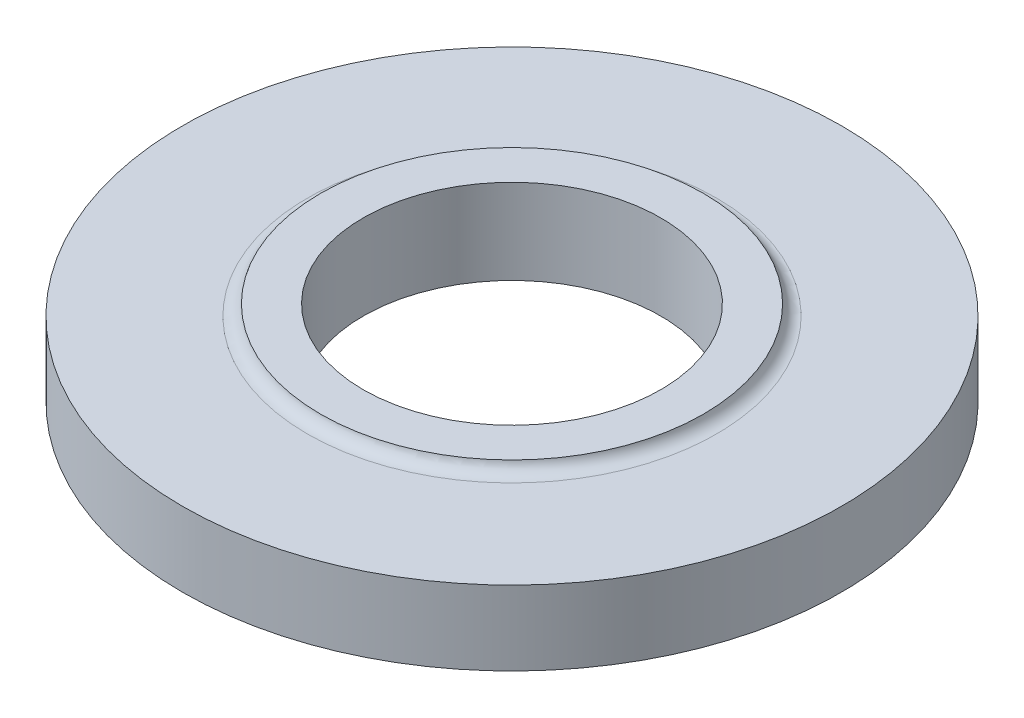
ISO-10303-21;
HEADER;
FILE_DESCRIPTION(('STEP AP214'),'2;1');
FILE_NAME('part.step','',(''),(''),'','','');
FILE_SCHEMA(('AUTOMOTIVE_DESIGN { 1 0 10303 214 1 1 1 1 }'));
ENDSEC;
DATA;
#1=APPLICATION_CONTEXT('core data for automotive mechanical design processes');
#2=APPLICATION_PROTOCOL_DEFINITION('international standard','automotive_design',2000,#1);
#3=PRODUCT_CONTEXT('',#1,'mechanical');
#4=PRODUCT('Part','Part','',(#3));
#5=PRODUCT_RELATED_PRODUCT_CATEGORY('part','',(#4));
#6=PRODUCT_DEFINITION_FORMATION('','',#4);
#7=PRODUCT_DEFINITION_CONTEXT('part definition',#1,'design');
#8=PRODUCT_DEFINITION('design','',#6,#7);
#9=PRODUCT_DEFINITION_SHAPE('','',#8);
#10=(LENGTH_UNIT() NAMED_UNIT(*) SI_UNIT(.MILLI.,.METRE.));
#11=(NAMED_UNIT(*) PLANE_ANGLE_UNIT() SI_UNIT($,.RADIAN.));
#12=(NAMED_UNIT(*) SI_UNIT($,.STERADIAN.) SOLID_ANGLE_UNIT());
#13=UNCERTAINTY_MEASURE_WITH_UNIT(LENGTH_MEASURE(1.E-05),#10,'distance_accuracy_value','');
#14=(GEOMETRIC_REPRESENTATION_CONTEXT(3) GLOBAL_UNCERTAINTY_ASSIGNED_CONTEXT((#13)) GLOBAL_UNIT_ASSIGNED_CONTEXT((#10,
#11,#12)) REPRESENTATION_CONTEXT('',''));
#15=CARTESIAN_POINT('',(0.,0.,0.));
#16=DIRECTION('',(0.,0.,1.));
#17=DIRECTION('',(1.,0.,0.));
#18=AXIS2_PLACEMENT_3D('',#15,#16,#17);
#19=CARTESIAN_POINT('',(0.,5.55625,0.));
#20=DIRECTION('',(0.,1.,0.));
#21=DIRECTION('',(0.,0.,1.));
#22=AXIS2_PLACEMENT_3D('',#19,#20,#21);
#23=PLANE('',#22);
#24=CARTESIAN_POINT('',(0.,5.55625,0.));
#25=DIRECTION('',(0.,1.,0.));
#26=DIRECTION('',(0.,0.,1.));
#27=AXIS2_PLACEMENT_3D('',#24,#25,#26);
#28=CIRCLE('',#27,15.2659993293304);
#29=CARTESIAN_POINT('',(0.,5.55625,15.2659993293304));
#30=VERTEX_POINT('',#29);
#31=EDGE_CURVE('E10',#30,#30,#28,.F.);
#32=ORIENTED_EDGE('',*,*,#31,.T.);
#33=EDGE_LOOP('',(#32));
#34=FACE_BOUND('',#33,.T.);
#35=CARTESIAN_POINT('',(0.,5.55625,0.));
#36=DIRECTION('',(0.,1.,0.));
#37=DIRECTION('',(0.,0.,1.));
#38=AXIS2_PLACEMENT_3D('',#35,#36,#37);
#39=CIRCLE('',#38,24.60625);
#40=CARTESIAN_POINT('',(0.,5.55625,24.60625));
#41=VERTEX_POINT('',#40);
#42=EDGE_CURVE('E38',#41,#41,#39,.T.);
#43=ORIENTED_EDGE('',*,*,#42,.T.);
#44=EDGE_LOOP('',(#43));
#45=FACE_BOUND('',#44,.T.);
#46=ADVANCED_FACE('F31',(#34,#45),#23,.T.);
#47=CARTESIAN_POINT('',(0.,5.55625,0.));
#48=DIRECTION('',(0.,-1.,0.));
#49=DIRECTION('',(0.,0.,-1.));
#50=AXIS2_PLACEMENT_3D('',#47,#48,#49);
#51=CYLINDRICAL_SURFACE('',#50,24.60625);
#52=ORIENTED_EDGE('',*,*,#42,.F.);
#53=EDGE_LOOP('',(#52));
#54=FACE_BOUND('',#53,.T.);
#55=CARTESIAN_POINT('',(0.,0.,0.));
#56=DIRECTION('',(0.,1.,0.));
#57=DIRECTION('',(0.,0.,1.));
#58=AXIS2_PLACEMENT_3D('',#55,#56,#57);
#59=CIRCLE('',#58,24.60625);
#60=CARTESIAN_POINT('',(0.,0.,24.60625));
#61=VERTEX_POINT('',#60);
#62=EDGE_CURVE('E42',#61,#61,#59,.T.);
#63=ORIENTED_EDGE('',*,*,#62,.T.);
#64=EDGE_LOOP('',(#63));
#65=FACE_BOUND('',#64,.T.);
#66=ADVANCED_FACE('F78',(#54,#65),#51,.T.);
#67=CARTESIAN_POINT('',(0.,0.,0.));
#68=DIRECTION('',(0.,1.,0.));
#69=DIRECTION('',(0.,0.,1.));
#70=AXIS2_PLACEMENT_3D('',#67,#68,#69);
#71=PLANE('',#70);
#72=CARTESIAN_POINT('',(0.,0.,0.));
#73=DIRECTION('',(0.,1.,0.));
#74=DIRECTION('',(0.,0.,1.));
#75=AXIS2_PLACEMENT_3D('',#72,#73,#74);
#76=CIRCLE('',#75,11.1125);
#77=CARTESIAN_POINT('',(0.,0.,11.1125));
#78=VERTEX_POINT('',#77);
#79=EDGE_CURVE('E51',#78,#78,#76,.T.);
#80=ORIENTED_EDGE('',*,*,#79,.T.);
#81=EDGE_LOOP('',(#80));
#82=FACE_BOUND('',#81,.T.);
#83=ORIENTED_EDGE('',*,*,#62,.F.);
#84=EDGE_LOOP('',(#83));
#85=FACE_BOUND('',#84,.T.);
#86=ADVANCED_FACE('F58',(#82,#85),#71,.F.);
#87=CARTESIAN_POINT('',(0.,6.35,0.));
#88=DIRECTION('',(0.,1.,0.));
#89=DIRECTION('',(0.,0.,1.));
#90=AXIS2_PLACEMENT_3D('',#87,#88,#89);
#91=PLANE('',#90);
#92=CARTESIAN_POINT('',(0.,6.35,0.));
#93=DIRECTION('',(0.,1.,0.));
#94=DIRECTION('',(0.,0.,1.));
#95=AXIS2_PLACEMENT_3D('',#92,#93,#94);
#96=CIRCLE('',#95,11.1125);
#97=CARTESIAN_POINT('',(0.,6.35,11.1125));
#98=VERTEX_POINT('',#97);
#99=EDGE_CURVE('E52',#98,#98,#96,.T.);
#100=ORIENTED_EDGE('',*,*,#99,.F.);
#101=EDGE_LOOP('',(#100));
#102=FACE_BOUND('',#101,.T.);
#103=CARTESIAN_POINT('',(0.,6.35,0.));
#104=DIRECTION('',(0.,1.,0.));
#105=DIRECTION('',(0.,0.,1.));
#106=AXIS2_PLACEMENT_3D('',#103,#104,#105);
#107=CIRCLE('',#106,14.2875);
#108=CARTESIAN_POINT('',(0.,6.35,14.2875));
#109=VERTEX_POINT('',#108);
#110=EDGE_CURVE('E47',#109,#109,#107,.T.);
#111=ORIENTED_EDGE('',*,*,#110,.T.);
#112=EDGE_LOOP('',(#111));
#113=FACE_BOUND('',#112,.T.);
#114=ADVANCED_FACE('F64',(#102,#113),#91,.T.);
#115=CARTESIAN_POINT('',(0.,0.,0.));
#116=DIRECTION('',(0.,1.,0.));
#117=DIRECTION('',(0.,0.,1.));
#118=AXIS2_PLACEMENT_3D('',#115,#116,#117);
#119=CYLINDRICAL_SURFACE('',#118,11.1125);
#120=ORIENTED_EDGE('',*,*,#79,.F.);
#121=EDGE_LOOP('',(#120));
#122=FACE_BOUND('',#121,.T.);
#123=ORIENTED_EDGE('',*,*,#99,.T.);
#124=EDGE_LOOP('',(#123));
#125=FACE_BOUND('',#124,.T.);
#126=ADVANCED_FACE('F61',(#122,#125),#119,.F.);
#127=CARTESIAN_POINT('',(0.,6.55625,0.));
#128=DIRECTION('',(0.,1.,0.));
#129=DIRECTION('',(0.,0.,1.));
#130=AXIS2_PLACEMENT_3D('',#127,#128,#129);
#131=TOROIDAL_SURFACE('',#130,15.2659993293304,1.);
#132=ORIENTED_EDGE('',*,*,#31,.F.);
#133=EDGE_LOOP('',(#132));
#134=FACE_BOUND('',#133,.T.);
#135=ORIENTED_EDGE('',*,*,#110,.F.);
#136=EDGE_LOOP('',(#135));
#137=FACE_BOUND('',#136,.T.);
#138=ADVANCED_FACE('F33',(#134,#137),#131,.F.);
#139=CLOSED_SHELL('',(#46,#66,#86,#114,#126,#138));
#140=MANIFOLD_SOLID_BREP('B2',#139);
#141=ADVANCED_BREP_SHAPE_REPRESENTATION('',(#18,#140),#14);
#142=SHAPE_DEFINITION_REPRESENTATION(#9,#141);
ENDSEC;
END-ISO-10303-21;
